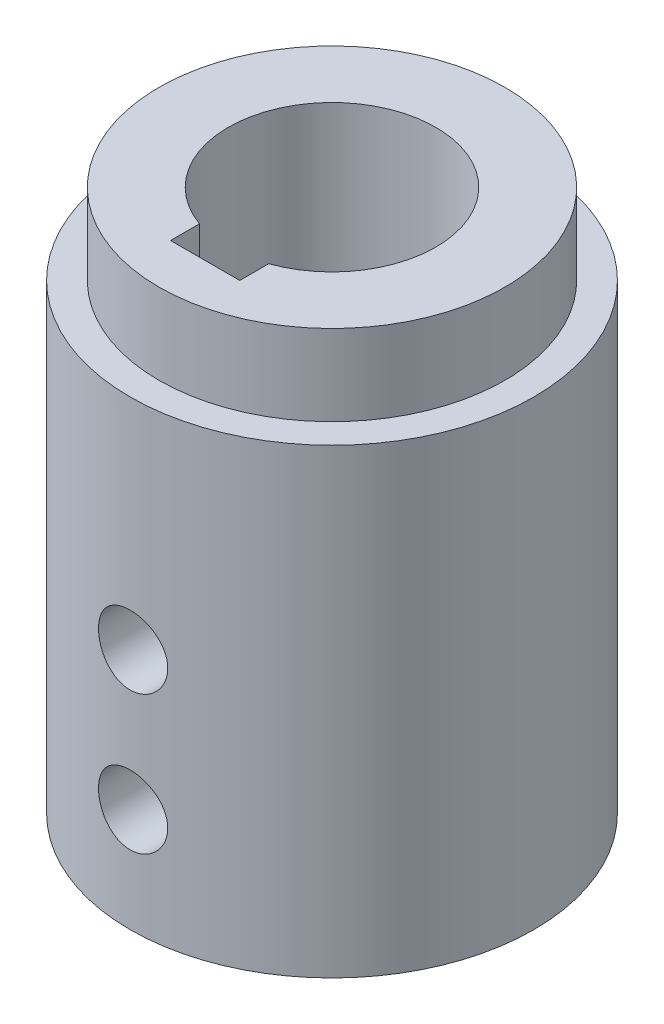
ISO-10303-21;
HEADER;
FILE_DESCRIPTION(('STEP AP214'),'2;1');
FILE_NAME('part.step','',(''),(''),'','','');
FILE_SCHEMA(('AUTOMOTIVE_DESIGN { 1 0 10303 214 1 1 1 1 }'));
ENDSEC;
DATA;
#1=APPLICATION_CONTEXT('core data for automotive mechanical design processes');
#2=APPLICATION_PROTOCOL_DEFINITION('international standard','automotive_design',2000,#1);
#3=PRODUCT_CONTEXT('',#1,'mechanical');
#4=PRODUCT('Part','Part','',(#3));
#5=PRODUCT_RELATED_PRODUCT_CATEGORY('part','',(#4));
#6=PRODUCT_DEFINITION_FORMATION('','',#4);
#7=PRODUCT_DEFINITION_CONTEXT('part definition',#1,'design');
#8=PRODUCT_DEFINITION('design','',#6,#7);
#9=PRODUCT_DEFINITION_SHAPE('','',#8);
#10=(LENGTH_UNIT() NAMED_UNIT(*) SI_UNIT(.MILLI.,.METRE.));
#11=(NAMED_UNIT(*) PLANE_ANGLE_UNIT() SI_UNIT($,.RADIAN.));
#12=(NAMED_UNIT(*) SI_UNIT($,.STERADIAN.) SOLID_ANGLE_UNIT());
#13=UNCERTAINTY_MEASURE_WITH_UNIT(LENGTH_MEASURE(1.E-05),#10,'distance_accuracy_value','');
#14=(GEOMETRIC_REPRESENTATION_CONTEXT(3) GLOBAL_UNCERTAINTY_ASSIGNED_CONTEXT((#13)) GLOBAL_UNIT_ASSIGNED_CONTEXT((#10,
#11,#12)) REPRESENTATION_CONTEXT('',''));
#15=CARTESIAN_POINT('',(0.,0.,0.));
#16=DIRECTION('',(0.,0.,1.));
#17=DIRECTION('',(1.,0.,0.));
#18=AXIS2_PLACEMENT_3D('',#15,#16,#17);
#19=CARTESIAN_POINT('',(0.,47.,11.));
#20=DIRECTION('',(0.,0.,1.));
#21=DIRECTION('',(1.,0.,0.));
#22=AXIS2_PLACEMENT_3D('',#19,#20,#21);
#23=PLANE('',#22);
#24=DIRECTION('',(0.,-1.,0.));
#25=VECTOR('',#24,1.);
#26=CARTESIAN_POINT('',(3.,47.,11.));
#27=LINE('',#26,#25);
#28=CARTESIAN_POINT('',(3.,21.,11.));
#29=VERTEX_POINT('',#28);
#30=CARTESIAN_POINT('',(3.,9.,11.));
#31=VERTEX_POINT('',#30);
#32=EDGE_CURVE('E143',#29,#31,#27,.T.);
#33=ORIENTED_EDGE('',*,*,#32,.T.);
#34=CARTESIAN_POINT('',(0.,9.,11.));
#35=DIRECTION('',(0.,0.,-1.));
#36=DIRECTION('',(-1.,0.,0.));
#37=AXIS2_PLACEMENT_3D('',#34,#35,#36);
#38=CIRCLE('',#37,3.);
#39=CARTESIAN_POINT('',(-3.,9.,11.));
#40=VERTEX_POINT('',#39);
#41=EDGE_CURVE('E52',#40,#31,#38,.T.);
#42=ORIENTED_EDGE('',*,*,#41,.F.);
#43=DIRECTION('',(0.,-1.,0.));
#44=VECTOR('',#43,1.);
#45=CARTESIAN_POINT('',(-3.,47.,11.));
#46=LINE('',#45,#44);
#47=CARTESIAN_POINT('',(-3.,21.,11.));
#48=VERTEX_POINT('',#47);
#49=EDGE_CURVE('E105',#48,#40,#46,.T.);
#50=ORIENTED_EDGE('',*,*,#49,.F.);
#51=CARTESIAN_POINT('',(0.,21.,11.));
#52=DIRECTION('',(0.,0.,1.));
#53=DIRECTION('',(1.,0.,0.));
#54=AXIS2_PLACEMENT_3D('',#51,#52,#53);
#55=CIRCLE('',#54,3.);
#56=EDGE_CURVE('E46',#48,#29,#55,.T.);
#57=ORIENTED_EDGE('',*,*,#56,.T.);
#58=EDGE_LOOP('',(#33,#42,#50,#57));
#59=FACE_BOUND('',#58,.T.);
#60=ADVANCED_FACE('F38',(#59),#23,.F.);
#61=CARTESIAN_POINT('',(3.,47.,11.));
#62=VERTEX_POINT('',#61);
#63=EDGE_CURVE('E101',#62,#29,#27,.T.);
#64=ORIENTED_EDGE('',*,*,#63,.T.);
#65=CARTESIAN_POINT('',(0.,21.,11.));
#66=DIRECTION('',(0.,0.,-1.));
#67=DIRECTION('',(-1.,0.,0.));
#68=AXIS2_PLACEMENT_3D('',#65,#66,#67);
#69=CIRCLE('',#68,3.);
#70=EDGE_CURVE('E58',#48,#29,#69,.T.);
#71=ORIENTED_EDGE('',*,*,#70,.F.);
#72=CARTESIAN_POINT('',(-3.,47.,11.));
#73=VERTEX_POINT('',#72);
#74=EDGE_CURVE('E99',#73,#48,#46,.T.);
#75=ORIENTED_EDGE('',*,*,#74,.F.);
#76=DIRECTION('',(-1.,0.,0.));
#77=VECTOR('',#76,1.);
#78=CARTESIAN_POINT('',(0.,47.,11.));
#79=LINE('',#78,#77);
#80=EDGE_CURVE('E140',#62,#73,#79,.T.);
#81=ORIENTED_EDGE('',*,*,#80,.F.);
#82=EDGE_LOOP('',(#64,#71,#75,#81));
#83=FACE_BOUND('',#82,.T.);
#84=ADVANCED_FACE('F96',(#83),#23,.F.);
#85=CARTESIAN_POINT('',(0.,47.,0.));
#86=DIRECTION('',(0.,-1.,0.));
#87=DIRECTION('',(0.,0.,-1.));
#88=AXIS2_PLACEMENT_3D('',#85,#86,#87);
#89=CYLINDRICAL_SURFACE('',#88,17.5);
#90=CARTESIAN_POINT('',(-3.,9.,17.2409396495667));
#91=CARTESIAN_POINT('',(-2.99999334322019,8.83282246032797,17.2409427238107));
#92=CARTESIAN_POINT('',(-2.9859784908008,8.6655553898746,17.2433975799678));
#93=CARTESIAN_POINT('',(-2.93031666162569,8.33571955276889,17.2529421043199));
#94=CARTESIAN_POINT('',(-2.88864464929492,8.17315518232045,17.260035971715));
#95=CARTESIAN_POINT('',(-2.77897046037278,7.85754570353687,17.2780319968807));
#96=CARTESIAN_POINT('',(-2.71099083852852,7.70449257087325,17.2889308916418));
#97=CARTESIAN_POINT('',(-2.55068812102202,7.41197929064787,17.313305084328));
#98=CARTESIAN_POINT('',(-2.45836757998599,7.27251771872825,17.3267801118422));
#99=CARTESIAN_POINT('',(-2.25097753821767,7.00967769550386,17.3549451758276));
#100=CARTESIAN_POINT('',(-2.13570381628918,6.88646144840326,17.3696453757954));
#101=CARTESIAN_POINT('',(-1.8861209742386,6.66101956179492,17.3985142730382));
#102=CARTESIAN_POINT('',(-1.75181070098527,6.55879519478093,17.4126829380499));
#103=CARTESIAN_POINT('',(-1.46691308220606,6.37762718746509,17.4390002009036));
#104=CARTESIAN_POINT('',(-1.31622811896212,6.29883495204562,17.4511354492007));
#105=CARTESIAN_POINT('',(-1.00351837852194,6.16774149755396,17.4719053147098));
#106=CARTESIAN_POINT('',(-0.841494381888664,6.11543845704082,17.4805401726064));
#107=CARTESIAN_POINT('',(-0.51238286841017,6.0393054207373,17.4932645851018));
#108=CARTESIAN_POINT('',(-0.345360157307003,6.01520267127088,17.4973976536599));
#109=CARTESIAN_POINT('',(-0.00959366953916466,5.99530588275656,17.5008024112351));
#110=CARTESIAN_POINT('',(0.159149982803278,5.9995098130732,17.500074448968));
#111=CARTESIAN_POINT('',(0.491702223591269,6.03589511071027,17.4938735157789));
#112=CARTESIAN_POINT('',(0.655543993481227,6.06778290993075,17.4884503360207));
#113=CARTESIAN_POINT('',(0.975516328537306,6.15816805787996,17.4735238964266));
#114=CARTESIAN_POINT('',(1.13164664814084,6.21666625338242,17.4640205067542));
#115=CARTESIAN_POINT('',(1.43263245757703,6.35890075078884,17.4419170029363));
#116=CARTESIAN_POINT('',(1.57743003521028,6.44275722592168,17.4293021974191));
#117=CARTESIAN_POINT('',(1.85100900942164,6.63323975639982,17.402375995437));
#118=CARTESIAN_POINT('',(1.9797890350765,6.73986775861394,17.3880644539551));
#119=CARTESIAN_POINT('',(2.21941290689028,6.97449255120822,17.3591182543925));
#120=CARTESIAN_POINT('',(2.33000539360505,7.10274598624269,17.344481806616));
#121=CARTESIAN_POINT('',(2.52814283244136,7.3761184279323,17.3167125731742));
#122=CARTESIAN_POINT('',(2.61568754736626,7.52123760813946,17.3035798029848));
#123=CARTESIAN_POINT('',(2.76529859974534,7.82452274188632,17.280303555666));
#124=CARTESIAN_POINT('',(2.82733330960205,7.98270460081445,17.2701637936693));
#125=CARTESIAN_POINT('',(2.92387975772742,8.30745673564648,17.2540820099746));
#126=CARTESIAN_POINT('',(2.95839406920572,8.47402622574218,17.2481395958225));
#127=CARTESIAN_POINT('',(2.99856320128749,8.80857247825451,17.2412016562193));
#128=CARTESIAN_POINT('',(3.00457695031049,8.97650490847694,17.2401446099915));
#129=CARTESIAN_POINT('',(2.98853197620301,9.3109762128296,17.2429330582015));
#130=CARTESIAN_POINT('',(2.96647440309381,9.47751514376714,17.2467783518012));
#131=CARTESIAN_POINT('',(2.89521941159178,9.8033231897104,17.258881270067));
#132=CARTESIAN_POINT('',(2.84620588243531,9.96263373133846,17.2671089866899));
#133=CARTESIAN_POINT('',(2.72262364312904,10.2707801836731,17.2870244527025));
#134=CARTESIAN_POINT('',(2.64805332503161,10.4196154345991,17.2987124197933));
#135=CARTESIAN_POINT('',(2.47463177769395,10.7041803254854,17.324373772823));
#136=CARTESIAN_POINT('',(2.37555125161584,10.839768284734,17.3383682986708));
#137=CARTESIAN_POINT('',(2.15623532353636,11.0925224519555,17.3670046347296));
#138=CARTESIAN_POINT('',(2.03599834380818,11.2096872848025,17.381646493154));
#139=CARTESIAN_POINT('',(1.77618954233157,11.4235865955531,17.4101230054923));
#140=CARTESIAN_POINT('',(1.63641893008565,11.5200812579464,17.4239469640735));
#141=CARTESIAN_POINT('',(1.34244211015567,11.6882185513154,17.4490567338254));
#142=CARTESIAN_POINT('',(1.18823639022304,11.7598620216096,17.4603426307116));
#143=CARTESIAN_POINT('',(0.870468175561604,11.8758931308123,17.4790582835881));
#144=CARTESIAN_POINT('',(0.706951958816392,11.9204045659635,17.4865055299022));
#145=CARTESIAN_POINT('',(0.374626699017908,11.9813060002943,17.4967788729714));
#146=CARTESIAN_POINT('',(0.205818119141563,11.9976984534333,17.4996053729806));
#147=CARTESIAN_POINT('',(-0.129988654143554,12.0018227351743,17.5003125469087));
#148=CARTESIAN_POINT('',(-0.296982352593287,11.9899188499276,17.4982560843078));
#149=CARTESIAN_POINT('',(-0.626554113404314,11.9385784635561,17.4895572282876));
#150=CARTESIAN_POINT('',(-0.789132204057233,11.89914213888,17.4829148642582));
#151=CARTESIAN_POINT('',(-1.10510688506267,11.7939992002669,17.4657883771442));
#152=CARTESIAN_POINT('',(-1.25851463077402,11.7283252830409,17.4553090369673));
#153=CARTESIAN_POINT('',(-1.55218949226269,11.5726125899403,17.4316504514312));
#154=CARTESIAN_POINT('',(-1.69245592673013,11.4825725517468,17.4184710662012));
#155=CARTESIAN_POINT('',(-1.95769741805989,11.2794002109157,17.390671178074));
#156=CARTESIAN_POINT('',(-2.08246711008153,11.1660018954169,17.3760351790944));
#157=CARTESIAN_POINT('',(-2.31133475460775,10.9198890936352,17.3470767953719));
#158=CARTESIAN_POINT('',(-2.41542785732055,10.7871700882132,17.3327544849054));
#159=CARTESIAN_POINT('',(-2.60071215805767,10.5049934932893,17.305928230343));
#160=CARTESIAN_POINT('',(-2.68172488708188,10.3554173179751,17.2934388002337));
#161=CARTESIAN_POINT('',(-2.81734831227997,10.0446231054956,17.2718645235111));
#162=CARTESIAN_POINT('',(-2.87198506892152,9.88341674121731,17.2627763183619));
#163=CARTESIAN_POINT('',(-2.94160477458961,9.60134515644605,17.2510229398289));
#164=CARTESIAN_POINT('',(-2.96346733737592,9.48217632149403,17.2472630378549));
#165=CARTESIAN_POINT('',(-2.99266721494119,9.24202060940369,17.2422203045731));
#166=CARTESIAN_POINT('',(-3.00000481939828,9.12103376857119,17.2409374238649));
#167=CARTESIAN_POINT('',(-3.,9.,17.2409396495667));
#168=B_SPLINE_CURVE_WITH_KNOTS('',3,(#90,#91,#92,#93,#94,#95,#96,#97,#98,#99,#100,#101,#102,
#103,#104,#105,#106,#107,#108,#109,#110,#111,#112,#113,#114,#115,#116,#117,#118,#119,#120,#121,
#122,#123,#124,#125,#126,#127,#128,#129,#130,#131,#132,#133,#134,#135,#136,#137,#138,#139,#140,
#141,#142,#143,#144,#145,#146,#147,#148,#149,#150,#151,#152,#153,#154,#155,#156,#157,#158,#159,
#160,#161,#162,#163,#164,#165,#166,#167),.UNSPECIFIED.,.T.,.F.,(4,2,2,2,2,2,2,2,2,2,2,2,2,2,2,2,
2,2,2,2,2,2,2,2,2,2,2,2,2,2,2,2,2,2,2,2,2,2,4),(0.,0.501089951588281,1.00263411527872,
1.50374923087268,2.00481177439394,2.51054946507383,3.01631780370884,3.52528645944317,
4.03422011289577,4.53818955823091,5.04212285070943,5.54077666683348,6.03944635181165,
6.54051729263446,7.0416310900563,7.54917511935568,8.05672437185112,8.56490100620875,
9.07303011950976,9.57474267565901,10.076434678393,10.5747459232883,11.0730885260168,
11.576282258526,12.0795135322501,12.588300132801,13.0970695480364,13.6034998598,
14.1098859728562,14.6097882655281,15.1096873544766,15.6089654137018,16.1082693436371,
16.6136095803368,17.1190682073767,17.6283353233665,18.1370982288975,18.4998862860552,
18.8626671078861),.UNSPECIFIED.);
#169=CARTESIAN_POINT('',(-3.,9.,17.2409396495667));
#170=VERTEX_POINT('',#169);
#171=EDGE_CURVE('E132',#170,#170,#168,.T.);
#172=ORIENTED_EDGE('',*,*,#171,.F.);
#173=EDGE_LOOP('',(#172));
#174=FACE_BOUND('',#173,.T.);
#175=CARTESIAN_POINT('',(-3.,21.,17.2409396495667));
#176=CARTESIAN_POINT('',(-2.99999334322019,20.832822460328,17.2409427238107));
#177=CARTESIAN_POINT('',(-2.9859784908008,20.6655553898746,17.2433975799678));
#178=CARTESIAN_POINT('',(-2.93031666162569,20.3357195527689,17.2529421043199));
#179=CARTESIAN_POINT('',(-2.88864464929492,20.1731551823205,17.260035971715));
#180=CARTESIAN_POINT('',(-2.77897046037278,19.8575457035369,17.2780319968807));
#181=CARTESIAN_POINT('',(-2.71099083852852,19.7044925708733,17.2889308916418));
#182=CARTESIAN_POINT('',(-2.55068812102202,19.4119792906479,17.313305084328));
#183=CARTESIAN_POINT('',(-2.458367579986,19.2725177187282,17.3267801118422));
#184=CARTESIAN_POINT('',(-2.25097753821767,19.0096776955039,17.3549451758276));
#185=CARTESIAN_POINT('',(-2.13570381628917,18.8864614484033,17.3696453757954));
#186=CARTESIAN_POINT('',(-1.8861209742386,18.6610195617949,17.3985142730382));
#187=CARTESIAN_POINT('',(-1.75181070098527,18.5587951947809,17.4126829380499));
#188=CARTESIAN_POINT('',(-1.46691308220606,18.3776271874651,17.4390002009036));
#189=CARTESIAN_POINT('',(-1.31622811896212,18.2988349520456,17.4511354492007));
#190=CARTESIAN_POINT('',(-1.00351837852194,18.167741497554,17.4719053147098));
#191=CARTESIAN_POINT('',(-0.841494381888665,18.1154384570408,17.4805401726064));
#192=CARTESIAN_POINT('',(-0.512382868410171,18.0393054207373,17.4932645851018));
#193=CARTESIAN_POINT('',(-0.345360157307004,18.0152026712709,17.4973976536599));
#194=CARTESIAN_POINT('',(-0.00959366953916509,17.9953058827566,17.5008024112351));
#195=CARTESIAN_POINT('',(0.159149982803278,17.9995098130732,17.500074448968));
#196=CARTESIAN_POINT('',(0.49170222359127,18.0358951107103,17.4938735157789));
#197=CARTESIAN_POINT('',(0.655543993481228,18.0677829099308,17.4884503360207));
#198=CARTESIAN_POINT('',(0.975516328537306,18.15816805788,17.4735238964266));
#199=CARTESIAN_POINT('',(1.13164664814083,18.2166662533824,17.4640205067542));
#200=CARTESIAN_POINT('',(1.43263245757703,18.3589007507888,17.4419170029363));
#201=CARTESIAN_POINT('',(1.57743003521027,18.4427572259217,17.4293021974191));
#202=CARTESIAN_POINT('',(1.85100900942164,18.6332397563998,17.402375995437));
#203=CARTESIAN_POINT('',(1.9797890350765,18.7398677586139,17.3880644539551));
#204=CARTESIAN_POINT('',(2.21941290689028,18.9744925512082,17.3591182543925));
#205=CARTESIAN_POINT('',(2.33000539360505,19.1027459862427,17.344481806616));
#206=CARTESIAN_POINT('',(2.52814283244136,19.3761184279323,17.3167125731742));
#207=CARTESIAN_POINT('',(2.61568754736626,19.5212376081395,17.3035798029848));
#208=CARTESIAN_POINT('',(2.76529859974534,19.8245227418863,17.280303555666));
#209=CARTESIAN_POINT('',(2.82733330960206,19.9827046008145,17.2701637936693));
#210=CARTESIAN_POINT('',(2.92387975772742,20.3074567356465,17.2540820099746));
#211=CARTESIAN_POINT('',(2.95839406920572,20.4740262257422,17.2481395958225));
#212=CARTESIAN_POINT('',(2.99856320128749,20.8085724782545,17.2412016562193));
#213=CARTESIAN_POINT('',(3.00457695031049,20.9765049084769,17.2401446099915));
#214=CARTESIAN_POINT('',(2.98853197620301,21.3109762128296,17.2429330582015));
#215=CARTESIAN_POINT('',(2.96647440309381,21.4775151437671,17.2467783518012));
#216=CARTESIAN_POINT('',(2.89521941159178,21.8033231897104,17.258881270067));
#217=CARTESIAN_POINT('',(2.84620588243531,21.9626337313385,17.2671089866899));
#218=CARTESIAN_POINT('',(2.72262364312904,22.2707801836731,17.2870244527025));
#219=CARTESIAN_POINT('',(2.64805332503161,22.4196154345991,17.2987124197933));
#220=CARTESIAN_POINT('',(2.47463177769395,22.7041803254854,17.324373772823));
#221=CARTESIAN_POINT('',(2.37555125161585,22.839768284734,17.3383682986708));
#222=CARTESIAN_POINT('',(2.15623532353637,23.0925224519555,17.3670046347296));
#223=CARTESIAN_POINT('',(2.03599834380818,23.2096872848025,17.381646493154));
#224=CARTESIAN_POINT('',(1.77618954233157,23.4235865955531,17.4101230054923));
#225=CARTESIAN_POINT('',(1.63641893008565,23.5200812579464,17.4239469640735));
#226=CARTESIAN_POINT('',(1.34244211015567,23.6882185513154,17.4490567338254));
#227=CARTESIAN_POINT('',(1.18823639022305,23.7598620216096,17.4603426307116));
#228=CARTESIAN_POINT('',(0.870468175561605,23.8758931308123,17.4790582835881));
#229=CARTESIAN_POINT('',(0.706951958816393,23.9204045659635,17.4865055299022));
#230=CARTESIAN_POINT('',(0.374626699017909,23.9813060002943,17.4967788729714));
#231=CARTESIAN_POINT('',(0.205818119141564,23.9976984534333,17.4996053729806));
#232=CARTESIAN_POINT('',(-0.129988654143552,24.0018227351743,17.5003125469087));
#233=CARTESIAN_POINT('',(-0.296982352593285,23.9899188499276,17.4982560843078));
#234=CARTESIAN_POINT('',(-0.626554113404312,23.9385784635561,17.4895572282876));
#235=CARTESIAN_POINT('',(-0.789132204057233,23.89914213888,17.4829148642582));
#236=CARTESIAN_POINT('',(-1.10510688506267,23.7939992002669,17.4657883771442));
#237=CARTESIAN_POINT('',(-1.25851463077402,23.7283252830409,17.4553090369673));
#238=CARTESIAN_POINT('',(-1.55218949226268,23.5726125899403,17.4316504514312));
#239=CARTESIAN_POINT('',(-1.69245592673013,23.4825725517468,17.4184710662012));
#240=CARTESIAN_POINT('',(-1.95769741805989,23.2794002109157,17.390671178074));
#241=CARTESIAN_POINT('',(-2.08246711008153,23.1660018954169,17.3760351790944));
#242=CARTESIAN_POINT('',(-2.31133475460775,22.9198890936352,17.3470767953719));
#243=CARTESIAN_POINT('',(-2.41542785732055,22.7871700882133,17.3327544849054));
#244=CARTESIAN_POINT('',(-2.60071215805767,22.5049934932893,17.305928230343));
#245=CARTESIAN_POINT('',(-2.68172488708188,22.3554173179751,17.2934388002337));
#246=CARTESIAN_POINT('',(-2.81734831227997,22.0446231054956,17.2718645235111));
#247=CARTESIAN_POINT('',(-2.87198506892152,21.8834167412173,17.2627763183619));
#248=CARTESIAN_POINT('',(-2.94160477458961,21.6013451564461,17.2510229398289));
#249=CARTESIAN_POINT('',(-2.96346733737592,21.482176321494,17.2472630378549));
#250=CARTESIAN_POINT('',(-2.9926672149412,21.2420206094037,17.2422203045731));
#251=CARTESIAN_POINT('',(-3.00000481939828,21.1210337685712,17.2409374238649));
#252=CARTESIAN_POINT('',(-3.,21.,17.2409396495667));
#253=B_SPLINE_CURVE_WITH_KNOTS('',3,(#175,#176,#177,#178,#179,#180,#181,#182,#183,#184,#185,
#186,#187,#188,#189,#190,#191,#192,#193,#194,#195,#196,#197,#198,#199,#200,#201,#202,#203,#204,
#205,#206,#207,#208,#209,#210,#211,#212,#213,#214,#215,#216,#217,#218,#219,#220,#221,#222,#223,
#224,#225,#226,#227,#228,#229,#230,#231,#232,#233,#234,#235,#236,#237,#238,#239,#240,#241,#242,
#243,#244,#245,#246,#247,#248,#249,#250,#251,#252),.UNSPECIFIED.,.T.,.F.,(4,2,2,2,2,2,2,2,2,2,2,
2,2,2,2,2,2,2,2,2,2,2,2,2,2,2,2,2,2,2,2,2,2,2,2,2,2,2,4),(0.,0.501089951588281,1.00263411527872,
1.50374923087268,2.00481177439394,2.51054946507384,3.01631780370884,3.52528645944317,
4.03422011289577,4.53818955823091,5.04212285070944,5.54077666683348,6.03944635181165,
6.54051729263446,7.0416310900563,7.54917511935568,8.05672437185112,8.56490100620876,
9.07303011950976,9.57474267565901,10.076434678393,10.5747459232883,11.0730885260168,
11.576282258526,12.0795135322501,12.588300132801,13.0970695480365,13.6034998598,
14.1098859728562,14.6097882655281,15.1096873544766,15.6089654137018,16.1082693436371,
16.6136095803368,17.1190682073767,17.6283353233665,18.1370982288975,18.4998862860552,
18.8626671078861),.UNSPECIFIED.);
#254=CARTESIAN_POINT('',(-3.,21.,17.2409396495667));
#255=VERTEX_POINT('',#254);
#256=EDGE_CURVE('E102',#255,#255,#253,.T.);
#257=ORIENTED_EDGE('',*,*,#256,.F.);
#258=EDGE_LOOP('',(#257));
#259=FACE_BOUND('',#258,.T.);
#260=CARTESIAN_POINT('',(0.,0.,0.));
#261=DIRECTION('',(0.,1.,0.));
#262=DIRECTION('',(0.,0.,1.));
#263=AXIS2_PLACEMENT_3D('',#260,#261,#262);
#264=CIRCLE('',#263,17.5);
#265=CARTESIAN_POINT('',(0.,0.,17.5));
#266=VERTEX_POINT('',#265);
#267=EDGE_CURVE('E92',#266,#266,#264,.T.);
#268=ORIENTED_EDGE('',*,*,#267,.T.);
#269=EDGE_LOOP('',(#268));
#270=FACE_BOUND('',#269,.T.);
#271=CARTESIAN_POINT('',(0.,40.,0.));
#272=DIRECTION('',(0.,1.,0.));
#273=DIRECTION('',(0.,0.,1.));
#274=AXIS2_PLACEMENT_3D('',#271,#272,#273);
#275=CIRCLE('',#274,17.5);
#276=CARTESIAN_POINT('',(0.,40.,17.5));
#277=VERTEX_POINT('',#276);
#278=EDGE_CURVE('E210',#277,#277,#275,.T.);
#279=ORIENTED_EDGE('',*,*,#278,.F.);
#280=EDGE_LOOP('',(#279));
#281=FACE_BOUND('',#280,.T.);
#282=ADVANCED_FACE('F40',(#174,#259,#270,#281),#89,.T.);
#283=CARTESIAN_POINT('',(0.,0.,0.));
#284=DIRECTION('',(0.,1.,0.));
#285=DIRECTION('',(0.,0.,1.));
#286=AXIS2_PLACEMENT_3D('',#283,#284,#285);
#287=PLANE('',#286);
#288=DIRECTION('',(-1.,0.,0.));
#289=VECTOR('',#288,1.);
#290=CARTESIAN_POINT('',(0.,0.,11.));
#291=LINE('',#290,#289);
#292=CARTESIAN_POINT('',(3.,0.,11.));
#293=VERTEX_POINT('',#292);
#294=CARTESIAN_POINT('',(-3.,0.,11.));
#295=VERTEX_POINT('',#294);
#296=EDGE_CURVE('E129',#293,#295,#291,.T.);
#297=ORIENTED_EDGE('',*,*,#296,.F.);
#298=DIRECTION('',(0.,0.,1.));
#299=VECTOR('',#298,1.);
#300=CARTESIAN_POINT('',(3.,0.,11.));
#301=LINE('',#300,#299);
#302=CARTESIAN_POINT('',(2.99999999999999,0.,8.48528137423857));
#303=VERTEX_POINT('',#302);
#304=EDGE_CURVE('E137',#303,#293,#301,.T.);
#305=ORIENTED_EDGE('',*,*,#304,.F.);
#306=CARTESIAN_POINT('',(0.,0.,0.));
#307=DIRECTION('',(0.,-1.,0.));
#308=DIRECTION('',(0.,0.,-1.));
#309=AXIS2_PLACEMENT_3D('',#306,#307,#308);
#310=CIRCLE('',#309,9.);
#311=CARTESIAN_POINT('',(-3.,0.,8.48528137423857));
#312=VERTEX_POINT('',#311);
#313=EDGE_CURVE('E134',#312,#303,#310,.T.);
#314=ORIENTED_EDGE('',*,*,#313,.F.);
#315=DIRECTION('',(0.,0.,-1.));
#316=VECTOR('',#315,1.);
#317=CARTESIAN_POINT('',(-3.,0.,11.));
#318=LINE('',#317,#316);
#319=EDGE_CURVE('E131',#295,#312,#318,.T.);
#320=ORIENTED_EDGE('',*,*,#319,.F.);
#321=EDGE_LOOP('',(#297,#305,#314,#320));
#322=FACE_BOUND('',#321,.T.);
#323=ORIENTED_EDGE('',*,*,#267,.F.);
#324=EDGE_LOOP('',(#323));
#325=FACE_BOUND('',#324,.T.);
#326=ADVANCED_FACE('F154',(#322,#325),#287,.F.);
#327=CARTESIAN_POINT('',(0.,40.,0.));
#328=DIRECTION('',(0.,1.,0.));
#329=DIRECTION('',(0.,0.,1.));
#330=AXIS2_PLACEMENT_3D('',#327,#328,#329);
#331=PLANE('',#330);
#332=CARTESIAN_POINT('',(0.,40.,0.));
#333=DIRECTION('',(0.,1.,0.));
#334=DIRECTION('',(0.,0.,1.));
#335=AXIS2_PLACEMENT_3D('',#332,#333,#334);
#336=CIRCLE('',#335,15.);
#337=CARTESIAN_POINT('',(0.,40.,15.));
#338=VERTEX_POINT('',#337);
#339=EDGE_CURVE('E207',#338,#338,#336,.T.);
#340=ORIENTED_EDGE('',*,*,#339,.F.);
#341=EDGE_LOOP('',(#340));
#342=FACE_BOUND('',#341,.T.);
#343=ORIENTED_EDGE('',*,*,#278,.T.);
#344=EDGE_LOOP('',(#343));
#345=FACE_BOUND('',#344,.T.);
#346=ADVANCED_FACE('F219',(#342,#345),#331,.T.);
#347=CARTESIAN_POINT('',(0.,40.,0.));
#348=DIRECTION('',(0.,1.,0.));
#349=DIRECTION('',(0.,0.,1.));
#350=AXIS2_PLACEMENT_3D('',#347,#348,#349);
#351=CYLINDRICAL_SURFACE('',#350,15.);
#352=ORIENTED_EDGE('',*,*,#339,.T.);
#353=EDGE_LOOP('',(#352));
#354=FACE_BOUND('',#353,.T.);
#355=CARTESIAN_POINT('',(0.,47.,0.));
#356=DIRECTION('',(0.,1.,0.));
#357=DIRECTION('',(0.,0.,1.));
#358=AXIS2_PLACEMENT_3D('',#355,#356,#357);
#359=CIRCLE('',#358,15.);
#360=CARTESIAN_POINT('',(0.,47.,15.));
#361=VERTEX_POINT('',#360);
#362=EDGE_CURVE('E142',#361,#361,#359,.T.);
#363=ORIENTED_EDGE('',*,*,#362,.F.);
#364=EDGE_LOOP('',(#363));
#365=FACE_BOUND('',#364,.T.);
#366=ADVANCED_FACE('F202',(#354,#365),#351,.T.);
#367=CARTESIAN_POINT('',(0.,47.,0.));
#368=DIRECTION('',(0.,1.,0.));
#369=DIRECTION('',(0.,0.,1.));
#370=AXIS2_PLACEMENT_3D('',#367,#368,#369);
#371=PLANE('',#370);
#372=DIRECTION('',(0.,0.,1.));
#373=VECTOR('',#372,1.);
#374=CARTESIAN_POINT('',(3.,47.,11.));
#375=LINE('',#374,#373);
#376=CARTESIAN_POINT('',(2.99999999999999,47.,8.48528137423857));
#377=VERTEX_POINT('',#376);
#378=EDGE_CURVE('E118',#377,#62,#375,.T.);
#379=ORIENTED_EDGE('',*,*,#378,.T.);
#380=ORIENTED_EDGE('',*,*,#80,.T.);
#381=DIRECTION('',(0.,0.,-1.));
#382=VECTOR('',#381,1.);
#383=CARTESIAN_POINT('',(-3.,47.,11.));
#384=LINE('',#383,#382);
#385=CARTESIAN_POINT('',(-3.,47.,8.48528137423857));
#386=VERTEX_POINT('',#385);
#387=EDGE_CURVE('E113',#73,#386,#384,.T.);
#388=ORIENTED_EDGE('',*,*,#387,.T.);
#389=CARTESIAN_POINT('',(0.,47.,0.));
#390=DIRECTION('',(0.,-1.,0.));
#391=DIRECTION('',(0.,0.,-1.));
#392=AXIS2_PLACEMENT_3D('',#389,#390,#391);
#393=CIRCLE('',#392,9.);
#394=EDGE_CURVE('E121',#386,#377,#393,.T.);
#395=ORIENTED_EDGE('',*,*,#394,.T.);
#396=EDGE_LOOP('',(#379,#380,#388,#395));
#397=FACE_BOUND('',#396,.T.);
#398=ORIENTED_EDGE('',*,*,#362,.T.);
#399=EDGE_LOOP('',(#398));
#400=FACE_BOUND('',#399,.T.);
#401=ADVANCED_FACE('F189',(#397,#400),#371,.T.);
#402=CARTESIAN_POINT('',(3.,47.,11.));
#403=DIRECTION('',(1.,0.,0.));
#404=DIRECTION('',(0.,0.,-1.));
#405=AXIS2_PLACEMENT_3D('',#402,#403,#404);
#406=PLANE('',#405);
#407=ORIENTED_EDGE('',*,*,#304,.T.);
#408=EDGE_CURVE('E144',#31,#293,#27,.T.);
#409=ORIENTED_EDGE('',*,*,#408,.F.);
#410=ORIENTED_EDGE('',*,*,#32,.F.);
#411=ORIENTED_EDGE('',*,*,#63,.F.);
#412=ORIENTED_EDGE('',*,*,#378,.F.);
#413=DIRECTION('',(0.,-1.,0.));
#414=VECTOR('',#413,1.);
#415=CARTESIAN_POINT('',(2.99999999999999,47.,8.48528137423857));
#416=LINE('',#415,#414);
#417=EDGE_CURVE('E115',#377,#303,#416,.T.);
#418=ORIENTED_EDGE('',*,*,#417,.T.);
#419=EDGE_LOOP('',(#407,#409,#410,#411,#412,#418));
#420=FACE_BOUND('',#419,.T.);
#421=ADVANCED_FACE('F148',(#420),#406,.F.);
#422=CARTESIAN_POINT('',(0.,47.,0.));
#423=DIRECTION('',(0.,-1.,0.));
#424=DIRECTION('',(0.,0.,-1.));
#425=AXIS2_PLACEMENT_3D('',#422,#423,#424);
#426=CYLINDRICAL_SURFACE('',#425,9.);
#427=ORIENTED_EDGE('',*,*,#313,.T.);
#428=ORIENTED_EDGE('',*,*,#417,.F.);
#429=ORIENTED_EDGE('',*,*,#394,.F.);
#430=DIRECTION('',(0.,-1.,0.));
#431=VECTOR('',#430,1.);
#432=CARTESIAN_POINT('',(-3.,47.,8.48528137423857));
#433=LINE('',#432,#431);
#434=EDGE_CURVE('E114',#386,#312,#433,.T.);
#435=ORIENTED_EDGE('',*,*,#434,.T.);
#436=EDGE_LOOP('',(#427,#428,#429,#435));
#437=FACE_BOUND('',#436,.T.);
#438=ADVANCED_FACE('F180',(#437),#426,.F.);
#439=CARTESIAN_POINT('',(-3.,47.,11.));
#440=DIRECTION('',(-1.,0.,0.));
#441=DIRECTION('',(0.,0.,1.));
#442=AXIS2_PLACEMENT_3D('',#439,#440,#441);
#443=PLANE('',#442);
#444=ORIENTED_EDGE('',*,*,#319,.T.);
#445=ORIENTED_EDGE('',*,*,#434,.F.);
#446=ORIENTED_EDGE('',*,*,#387,.F.);
#447=ORIENTED_EDGE('',*,*,#74,.T.);
#448=ORIENTED_EDGE('',*,*,#49,.T.);
#449=EDGE_CURVE('E108',#40,#295,#46,.T.);
#450=ORIENTED_EDGE('',*,*,#449,.T.);
#451=EDGE_LOOP('',(#444,#445,#446,#447,#448,#450));
#452=FACE_BOUND('',#451,.T.);
#453=ADVANCED_FACE('F111',(#452),#443,.F.);
#454=ORIENTED_EDGE('',*,*,#449,.F.);
#455=CARTESIAN_POINT('',(0.,9.,11.));
#456=DIRECTION('',(0.,0.,1.));
#457=DIRECTION('',(1.,0.,0.));
#458=AXIS2_PLACEMENT_3D('',#455,#456,#457);
#459=CIRCLE('',#458,3.);
#460=EDGE_CURVE('E11',#40,#31,#459,.T.);
#461=ORIENTED_EDGE('',*,*,#460,.T.);
#462=ORIENTED_EDGE('',*,*,#408,.T.);
#463=ORIENTED_EDGE('',*,*,#296,.T.);
#464=EDGE_LOOP('',(#454,#461,#462,#463));
#465=FACE_BOUND('',#464,.T.);
#466=ADVANCED_FACE('F156',(#465),#23,.F.);
#467=CARTESIAN_POINT('',(0.,21.,17.501));
#468=DIRECTION('',(0.,0.,-1.));
#469=DIRECTION('',(-1.,0.,0.));
#470=AXIS2_PLACEMENT_3D('',#467,#468,#469);
#471=CYLINDRICAL_SURFACE('',#470,3.);
#472=ORIENTED_EDGE('',*,*,#256,.T.);
#473=EDGE_LOOP('',(#472));
#474=FACE_BOUND('',#473,.T.);
#475=ORIENTED_EDGE('',*,*,#70,.T.);
#476=ORIENTED_EDGE('',*,*,#56,.F.);
#477=EDGE_LOOP('',(#475,#476));
#478=FACE_BOUND('',#477,.T.);
#479=ADVANCED_FACE('F87',(#474,#478),#471,.F.);
#480=CARTESIAN_POINT('',(0.,9.,17.501));
#481=DIRECTION('',(0.,0.,-1.));
#482=DIRECTION('',(-1.,0.,0.));
#483=AXIS2_PLACEMENT_3D('',#480,#481,#482);
#484=CYLINDRICAL_SURFACE('',#483,3.);
#485=ORIENTED_EDGE('',*,*,#171,.T.);
#486=EDGE_LOOP('',(#485));
#487=FACE_BOUND('',#486,.T.);
#488=ORIENTED_EDGE('',*,*,#41,.T.);
#489=ORIENTED_EDGE('',*,*,#460,.F.);
#490=EDGE_LOOP('',(#488,#489));
#491=FACE_BOUND('',#490,.T.);
#492=ADVANCED_FACE('F157',(#487,#491),#484,.F.);
#493=CLOSED_SHELL('',(#60,#84,#282,#326,#346,#366,#401,#421,#438,#453,#466,#479,#492));
#494=MANIFOLD_SOLID_BREP('B2',#493);
#495=ADVANCED_BREP_SHAPE_REPRESENTATION('',(#18,#494),#14);
#496=SHAPE_DEFINITION_REPRESENTATION(#9,#495);
ENDSEC;
END-ISO-10303-21;
